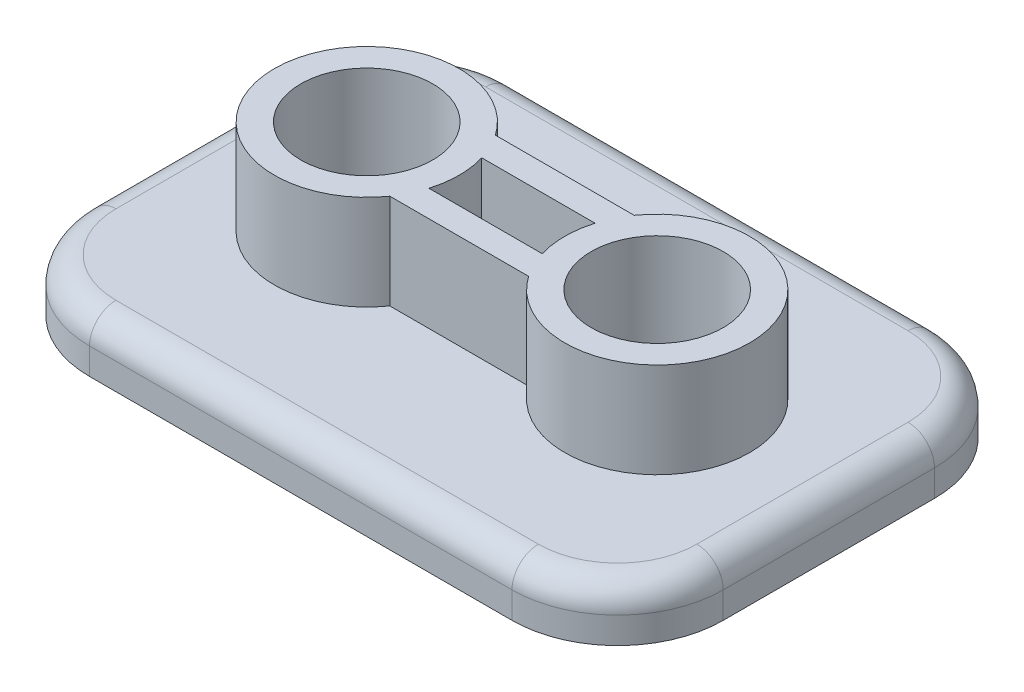
ISO-10303-21;
HEADER;
FILE_DESCRIPTION(('STEP AP214'),'2;1');
FILE_NAME('part.step','',(''),(''),'','','');
FILE_SCHEMA(('AUTOMOTIVE_DESIGN { 1 0 10303 214 1 1 1 1 }'));
ENDSEC;
DATA;
#1=APPLICATION_CONTEXT('core data for automotive mechanical design processes');
#2=APPLICATION_PROTOCOL_DEFINITION('international standard','automotive_design',2000,#1);
#3=PRODUCT_CONTEXT('',#1,'mechanical');
#4=PRODUCT('Part','Part','',(#3));
#5=PRODUCT_RELATED_PRODUCT_CATEGORY('part','',(#4));
#6=PRODUCT_DEFINITION_FORMATION('','',#4);
#7=PRODUCT_DEFINITION_CONTEXT('part definition',#1,'design');
#8=PRODUCT_DEFINITION('design','',#6,#7);
#9=PRODUCT_DEFINITION_SHAPE('','',#8);
#10=(LENGTH_UNIT() NAMED_UNIT(*) SI_UNIT(.MILLI.,.METRE.));
#11=(NAMED_UNIT(*) PLANE_ANGLE_UNIT() SI_UNIT($,.RADIAN.));
#12=(NAMED_UNIT(*) SI_UNIT($,.STERADIAN.) SOLID_ANGLE_UNIT());
#13=UNCERTAINTY_MEASURE_WITH_UNIT(LENGTH_MEASURE(1.E-05),#10,'distance_accuracy_value','');
#14=(GEOMETRIC_REPRESENTATION_CONTEXT(3) GLOBAL_UNCERTAINTY_ASSIGNED_CONTEXT((#13)) GLOBAL_UNIT_ASSIGNED_CONTEXT((#10,
#11,#12)) REPRESENTATION_CONTEXT('',''));
#15=CARTESIAN_POINT('',(0.,0.,0.));
#16=DIRECTION('',(0.,0.,1.));
#17=DIRECTION('',(1.,0.,0.));
#18=AXIS2_PLACEMENT_3D('',#15,#16,#17);
#19=CARTESIAN_POINT('',(0.,10.,0.));
#20=DIRECTION('',(0.,-1.,0.));
#21=DIRECTION('',(0.,0.,-1.));
#22=AXIS2_PLACEMENT_3D('',#19,#20,#21);
#23=PLANE('',#22);
#24=DIRECTION('',(-1.,0.,0.));
#25=VECTOR('',#24,1.);
#26=CARTESIAN_POINT('',(0.,10.,-75.));
#27=LINE('',#26,#25);
#28=CARTESIAN_POINT('',(100.,10.,-75.));
#29=VERTEX_POINT('',#28);
#30=CARTESIAN_POINT('',(20.,10.,-75.));
#31=VERTEX_POINT('',#30);
#32=EDGE_CURVE('E363',#29,#31,#27,.T.);
#33=ORIENTED_EDGE('',*,*,#32,.T.);
#34=CARTESIAN_POINT('',(20.,10.,-60.));
#35=DIRECTION('',(0.,-1.,0.));
#36=DIRECTION('',(0.,0.,-1.));
#37=AXIS2_PLACEMENT_3D('',#34,#35,#36);
#38=CIRCLE('',#37,15.);
#39=CARTESIAN_POINT('',(5.,10.,-60.));
#40=VERTEX_POINT('',#39);
#41=EDGE_CURVE('E366',#31,#40,#38,.F.);
#42=ORIENTED_EDGE('',*,*,#41,.T.);
#43=DIRECTION('',(0.,0.,1.));
#44=VECTOR('',#43,1.);
#45=CARTESIAN_POINT('',(5.,10.,0.));
#46=LINE('',#45,#44);
#47=CARTESIAN_POINT('',(5.,10.,-20.));
#48=VERTEX_POINT('',#47);
#49=EDGE_CURVE('E345',#40,#48,#46,.T.);
#50=ORIENTED_EDGE('',*,*,#49,.T.);
#51=CARTESIAN_POINT('',(20.,10.,-20.));
#52=DIRECTION('',(0.,-1.,0.));
#53=DIRECTION('',(0.,0.,-1.));
#54=AXIS2_PLACEMENT_3D('',#51,#52,#53);
#55=CIRCLE('',#54,15.);
#56=CARTESIAN_POINT('',(20.,10.,-5.));
#57=VERTEX_POINT('',#56);
#58=EDGE_CURVE('E348',#48,#57,#55,.F.);
#59=ORIENTED_EDGE('',*,*,#58,.T.);
#60=DIRECTION('',(1.,0.,0.));
#61=VECTOR('',#60,1.);
#62=CARTESIAN_POINT('',(0.,10.,-5.));
#63=LINE('',#62,#61);
#64=CARTESIAN_POINT('',(100.,10.,-5.));
#65=VERTEX_POINT('',#64);
#66=EDGE_CURVE('E351',#57,#65,#63,.T.);
#67=ORIENTED_EDGE('',*,*,#66,.T.);
#68=CARTESIAN_POINT('',(100.,10.,-20.));
#69=DIRECTION('',(0.,-1.,0.));
#70=DIRECTION('',(0.,0.,-1.));
#71=AXIS2_PLACEMENT_3D('',#68,#69,#70);
#72=CIRCLE('',#71,15.);
#73=CARTESIAN_POINT('',(115.,10.,-20.));
#74=VERTEX_POINT('',#73);
#75=EDGE_CURVE('E354',#65,#74,#72,.F.);
#76=ORIENTED_EDGE('',*,*,#75,.T.);
#77=DIRECTION('',(0.,0.,-1.));
#78=VECTOR('',#77,1.);
#79=CARTESIAN_POINT('',(115.,10.,0.));
#80=LINE('',#79,#78);
#81=CARTESIAN_POINT('',(115.,10.,-60.));
#82=VERTEX_POINT('',#81);
#83=EDGE_CURVE('E357',#74,#82,#80,.T.);
#84=ORIENTED_EDGE('',*,*,#83,.T.);
#85=CARTESIAN_POINT('',(100.,10.,-60.));
#86=DIRECTION('',(0.,-1.,0.));
#87=DIRECTION('',(0.,0.,-1.));
#88=AXIS2_PLACEMENT_3D('',#85,#86,#87);
#89=CIRCLE('',#88,15.);
#90=EDGE_CURVE('E360',#82,#29,#89,.F.);
#91=ORIENTED_EDGE('',*,*,#90,.T.);
#92=EDGE_LOOP('',(#33,#42,#50,#59,#67,#76,#84,#91));
#93=FACE_BOUND('',#92,.T.);
#94=CARTESIAN_POINT('',(87.5,10.,-40.));
#95=DIRECTION('',(0.,1.,0.));
#96=DIRECTION('',(0.,0.,1.));
#97=AXIS2_PLACEMENT_3D('',#94,#95,#96);
#98=CIRCLE('',#97,17.5);
#99=CARTESIAN_POINT('',(73.1385933836549,10.,-50.));
#100=VERTEX_POINT('',#99);
#101=CARTESIAN_POINT('',(73.1385933836549,10.,-30.));
#102=VERTEX_POINT('',#101);
#103=EDGE_CURVE('E249',#100,#102,#98,.F.);
#104=ORIENTED_EDGE('',*,*,#103,.T.);
#105=DIRECTION('',(-1.,0.,0.));
#106=VECTOR('',#105,1.);
#107=CARTESIAN_POINT('',(0.,10.,-30.));
#108=LINE('',#107,#106);
#109=CARTESIAN_POINT('',(46.8614066163451,10.,-30.));
#110=VERTEX_POINT('',#109);
#111=EDGE_CURVE('E260',#102,#110,#108,.T.);
#112=ORIENTED_EDGE('',*,*,#111,.T.);
#113=CARTESIAN_POINT('',(32.5,10.,-40.));
#114=DIRECTION('',(0.,1.,0.));
#115=DIRECTION('',(0.,0.,1.));
#116=AXIS2_PLACEMENT_3D('',#113,#114,#115);
#117=CIRCLE('',#116,17.5);
#118=CARTESIAN_POINT('',(46.8614066163451,10.,-50.));
#119=VERTEX_POINT('',#118);
#120=EDGE_CURVE('E215',#119,#110,#117,.T.);
#121=ORIENTED_EDGE('',*,*,#120,.F.);
#122=DIRECTION('',(-1.,0.,0.));
#123=VECTOR('',#122,1.);
#124=CARTESIAN_POINT('',(0.,10.,-50.));
#125=LINE('',#124,#123);
#126=EDGE_CURVE('E264',#100,#119,#125,.T.);
#127=ORIENTED_EDGE('',*,*,#126,.F.);
#128=EDGE_LOOP('',(#104,#112,#121,#127));
#129=FACE_BOUND('',#128,.T.);
#130=ADVANCED_FACE('F41',(#93,#129),#23,.F.);
#131=CARTESIAN_POINT('',(0.,10.,0.));
#132=DIRECTION('',(1.,0.,0.));
#133=DIRECTION('',(0.,0.,-1.));
#134=AXIS2_PLACEMENT_3D('',#131,#132,#133);
#135=PLANE('',#134);
#136=DIRECTION('',(0.,-1.,0.));
#137=VECTOR('',#136,1.);
#138=CARTESIAN_POINT('',(0.,10.,-20.));
#139=LINE('',#138,#137);
#140=CARTESIAN_POINT('',(0.,0.,-20.));
#141=VERTEX_POINT('',#140);
#142=CARTESIAN_POINT('',(0.,5.,-20.));
#143=VERTEX_POINT('',#142);
#144=EDGE_CURVE('E272',#141,#143,#139,.F.);
#145=ORIENTED_EDGE('',*,*,#144,.T.);
#146=DIRECTION('',(0.,0.,1.));
#147=VECTOR('',#146,1.);
#148=CARTESIAN_POINT('',(0.,5.,0.));
#149=LINE('',#148,#147);
#150=CARTESIAN_POINT('',(0.,5.,-60.));
#151=VERTEX_POINT('',#150);
#152=EDGE_CURVE('E11',#143,#151,#149,.F.);
#153=ORIENTED_EDGE('',*,*,#152,.T.);
#154=DIRECTION('',(0.,-1.,0.));
#155=VECTOR('',#154,1.);
#156=CARTESIAN_POINT('',(0.,10.,-60.));
#157=LINE('',#156,#155);
#158=CARTESIAN_POINT('',(0.,0.,-60.));
#159=VERTEX_POINT('',#158);
#160=EDGE_CURVE('E310',#151,#159,#157,.T.);
#161=ORIENTED_EDGE('',*,*,#160,.T.);
#162=DIRECTION('',(0.,0.,1.));
#163=VECTOR('',#162,1.);
#164=CARTESIAN_POINT('',(0.,0.,0.));
#165=LINE('',#164,#163);
#166=EDGE_CURVE('E285',#159,#141,#165,.T.);
#167=ORIENTED_EDGE('',*,*,#166,.T.);
#168=EDGE_LOOP('',(#145,#153,#161,#167));
#169=FACE_BOUND('',#168,.T.);
#170=ADVANCED_FACE('F474',(#169),#135,.F.);
#171=CARTESIAN_POINT('',(0.,10.,0.));
#172=DIRECTION('',(0.,0.,-1.));
#173=DIRECTION('',(-1.,0.,0.));
#174=AXIS2_PLACEMENT_3D('',#171,#172,#173);
#175=PLANE('',#174);
#176=DIRECTION('',(0.,-1.,0.));
#177=VECTOR('',#176,1.);
#178=CARTESIAN_POINT('',(100.,10.,0.));
#179=LINE('',#178,#177);
#180=CARTESIAN_POINT('',(100.,0.,0.));
#181=VERTEX_POINT('',#180);
#182=CARTESIAN_POINT('',(100.,5.,0.));
#183=VERTEX_POINT('',#182);
#184=EDGE_CURVE('E342',#181,#183,#179,.F.);
#185=ORIENTED_EDGE('',*,*,#184,.T.);
#186=DIRECTION('',(1.,0.,0.));
#187=VECTOR('',#186,1.);
#188=CARTESIAN_POINT('',(0.,5.,0.));
#189=LINE('',#188,#187);
#190=CARTESIAN_POINT('',(20.,5.,0.));
#191=VERTEX_POINT('',#190);
#192=EDGE_CURVE('E66',#183,#191,#189,.F.);
#193=ORIENTED_EDGE('',*,*,#192,.T.);
#194=DIRECTION('',(0.,-1.,0.));
#195=VECTOR('',#194,1.);
#196=CARTESIAN_POINT('',(20.,10.,0.));
#197=LINE('',#196,#195);
#198=CARTESIAN_POINT('',(20.,0.,0.));
#199=VERTEX_POINT('',#198);
#200=EDGE_CURVE('E339',#191,#199,#197,.T.);
#201=ORIENTED_EDGE('',*,*,#200,.T.);
#202=DIRECTION('',(1.,0.,0.));
#203=VECTOR('',#202,1.);
#204=CARTESIAN_POINT('',(0.,0.,0.));
#205=LINE('',#204,#203);
#206=EDGE_CURVE('E297',#199,#181,#205,.T.);
#207=ORIENTED_EDGE('',*,*,#206,.T.);
#208=EDGE_LOOP('',(#185,#193,#201,#207));
#209=FACE_BOUND('',#208,.T.);
#210=ADVANCED_FACE('F433',(#209),#175,.F.);
#211=CARTESIAN_POINT('',(120.,10.,0.));
#212=DIRECTION('',(-1.,0.,0.));
#213=DIRECTION('',(0.,0.,1.));
#214=AXIS2_PLACEMENT_3D('',#211,#212,#213);
#215=PLANE('',#214);
#216=DIRECTION('',(0.,-1.,0.));
#217=VECTOR('',#216,1.);
#218=CARTESIAN_POINT('',(120.,10.,-60.));
#219=LINE('',#218,#217);
#220=CARTESIAN_POINT('',(120.,0.,-60.));
#221=VERTEX_POINT('',#220);
#222=CARTESIAN_POINT('',(120.,5.,-60.));
#223=VERTEX_POINT('',#222);
#224=EDGE_CURVE('E335',#221,#223,#219,.F.);
#225=ORIENTED_EDGE('',*,*,#224,.T.);
#226=DIRECTION('',(0.,0.,-1.));
#227=VECTOR('',#226,1.);
#228=CARTESIAN_POINT('',(120.,5.,0.));
#229=LINE('',#228,#227);
#230=CARTESIAN_POINT('',(120.,5.,-20.));
#231=VERTEX_POINT('',#230);
#232=EDGE_CURVE('E380',#223,#231,#229,.F.);
#233=ORIENTED_EDGE('',*,*,#232,.T.);
#234=DIRECTION('',(0.,-1.,0.));
#235=VECTOR('',#234,1.);
#236=CARTESIAN_POINT('',(120.,10.,-20.));
#237=LINE('',#236,#235);
#238=CARTESIAN_POINT('',(120.,0.,-20.));
#239=VERTEX_POINT('',#238);
#240=EDGE_CURVE('E332',#231,#239,#237,.T.);
#241=ORIENTED_EDGE('',*,*,#240,.T.);
#242=DIRECTION('',(0.,0.,-1.));
#243=VECTOR('',#242,1.);
#244=CARTESIAN_POINT('',(120.,0.,0.));
#245=LINE('',#244,#243);
#246=EDGE_CURVE('E301',#239,#221,#245,.T.);
#247=ORIENTED_EDGE('',*,*,#246,.T.);
#248=EDGE_LOOP('',(#225,#233,#241,#247));
#249=FACE_BOUND('',#248,.T.);
#250=ADVANCED_FACE('F444',(#249),#215,.F.);
#251=CARTESIAN_POINT('',(0.,10.,-80.));
#252=DIRECTION('',(0.,0.,1.));
#253=DIRECTION('',(1.,0.,0.));
#254=AXIS2_PLACEMENT_3D('',#251,#252,#253);
#255=PLANE('',#254);
#256=DIRECTION('',(0.,-1.,0.));
#257=VECTOR('',#256,1.);
#258=CARTESIAN_POINT('',(20.,10.,-80.));
#259=LINE('',#258,#257);
#260=CARTESIAN_POINT('',(20.,0.,-80.));
#261=VERTEX_POINT('',#260);
#262=CARTESIAN_POINT('',(20.,5.,-80.));
#263=VERTEX_POINT('',#262);
#264=EDGE_CURVE('E328',#261,#263,#259,.F.);
#265=ORIENTED_EDGE('',*,*,#264,.T.);
#266=DIRECTION('',(-1.,0.,0.));
#267=VECTOR('',#266,1.);
#268=CARTESIAN_POINT('',(0.,5.,-80.));
#269=LINE('',#268,#267);
#270=CARTESIAN_POINT('',(100.,5.,-80.));
#271=VERTEX_POINT('',#270);
#272=EDGE_CURVE('E374',#263,#271,#269,.F.);
#273=ORIENTED_EDGE('',*,*,#272,.T.);
#274=DIRECTION('',(0.,-1.,0.));
#275=VECTOR('',#274,1.);
#276=CARTESIAN_POINT('',(100.,10.,-80.));
#277=LINE('',#276,#275);
#278=CARTESIAN_POINT('',(100.,0.,-80.));
#279=VERTEX_POINT('',#278);
#280=EDGE_CURVE('E325',#271,#279,#277,.T.);
#281=ORIENTED_EDGE('',*,*,#280,.T.);
#282=DIRECTION('',(-1.,0.,0.));
#283=VECTOR('',#282,1.);
#284=CARTESIAN_POINT('',(0.,0.,-80.));
#285=LINE('',#284,#283);
#286=EDGE_CURVE('E273',#279,#261,#285,.T.);
#287=ORIENTED_EDGE('',*,*,#286,.T.);
#288=EDGE_LOOP('',(#265,#273,#281,#287));
#289=FACE_BOUND('',#288,.T.);
#290=ADVANCED_FACE('F602',(#289),#255,.F.);
#291=CARTESIAN_POINT('',(0.,0.,0.));
#292=DIRECTION('',(0.,-1.,0.));
#293=DIRECTION('',(0.,0.,-1.));
#294=AXIS2_PLACEMENT_3D('',#291,#292,#293);
#295=PLANE('',#294);
#296=ORIENTED_EDGE('',*,*,#166,.F.);
#297=CARTESIAN_POINT('',(20.,0.,-60.));
#298=DIRECTION('',(0.,-1.,0.));
#299=DIRECTION('',(0.,0.,-1.));
#300=AXIS2_PLACEMENT_3D('',#297,#298,#299);
#301=CIRCLE('',#300,20.);
#302=EDGE_CURVE('E322',#159,#261,#301,.T.);
#303=ORIENTED_EDGE('',*,*,#302,.T.);
#304=ORIENTED_EDGE('',*,*,#286,.F.);
#305=CARTESIAN_POINT('',(100.,0.,-60.));
#306=DIRECTION('',(0.,-1.,0.));
#307=DIRECTION('',(0.,0.,-1.));
#308=AXIS2_PLACEMENT_3D('',#305,#306,#307);
#309=CIRCLE('',#308,20.);
#310=EDGE_CURVE('E319',#279,#221,#309,.T.);
#311=ORIENTED_EDGE('',*,*,#310,.T.);
#312=ORIENTED_EDGE('',*,*,#246,.F.);
#313=CARTESIAN_POINT('',(100.,0.,-20.));
#314=DIRECTION('',(0.,-1.,0.));
#315=DIRECTION('',(0.,0.,-1.));
#316=AXIS2_PLACEMENT_3D('',#313,#314,#315);
#317=CIRCLE('',#316,20.);
#318=EDGE_CURVE('E316',#239,#181,#317,.T.);
#319=ORIENTED_EDGE('',*,*,#318,.T.);
#320=ORIENTED_EDGE('',*,*,#206,.F.);
#321=CARTESIAN_POINT('',(20.,0.,-20.));
#322=DIRECTION('',(0.,-1.,0.));
#323=DIRECTION('',(0.,0.,-1.));
#324=AXIS2_PLACEMENT_3D('',#321,#322,#323);
#325=CIRCLE('',#324,20.);
#326=EDGE_CURVE('E313',#199,#141,#325,.T.);
#327=ORIENTED_EDGE('',*,*,#326,.T.);
#328=EDGE_LOOP('',(#296,#303,#304,#311,#312,#319,#320,#327));
#329=FACE_BOUND('',#328,.T.);
#330=ADVANCED_FACE('F438',(#329),#295,.T.);
#331=CARTESIAN_POINT('',(0.,28.,-30.));
#332=DIRECTION('',(0.,0.,1.));
#333=DIRECTION('',(1.,0.,0.));
#334=AXIS2_PLACEMENT_3D('',#331,#332,#333);
#335=PLANE('',#334);
#336=ORIENTED_EDGE('',*,*,#111,.F.);
#337=DIRECTION('',(0.,-1.,0.));
#338=VECTOR('',#337,1.);
#339=CARTESIAN_POINT('',(73.1385933836549,28.,-30.));
#340=LINE('',#339,#338);
#341=CARTESIAN_POINT('',(73.1385933836549,28.,-30.));
#342=VERTEX_POINT('',#341);
#343=EDGE_CURVE('E282',#342,#102,#340,.T.);
#344=ORIENTED_EDGE('',*,*,#343,.F.);
#345=DIRECTION('',(-1.,0.,0.));
#346=VECTOR('',#345,1.);
#347=CARTESIAN_POINT('',(0.,28.,-30.));
#348=LINE('',#347,#346);
#349=CARTESIAN_POINT('',(46.8614066163451,28.,-30.));
#350=VERTEX_POINT('',#349);
#351=EDGE_CURVE('E220',#342,#350,#348,.T.);
#352=ORIENTED_EDGE('',*,*,#351,.T.);
#353=DIRECTION('',(0.,-1.,0.));
#354=VECTOR('',#353,1.);
#355=CARTESIAN_POINT('',(46.8614066163451,28.,-30.));
#356=LINE('',#355,#354);
#357=EDGE_CURVE('E192',#350,#110,#356,.T.);
#358=ORIENTED_EDGE('',*,*,#357,.T.);
#359=EDGE_LOOP('',(#336,#344,#352,#358));
#360=FACE_BOUND('',#359,.T.);
#361=ADVANCED_FACE('F523',(#360),#335,.T.);
#362=CARTESIAN_POINT('',(87.5,28.,-40.));
#363=DIRECTION('',(0.,-1.,0.));
#364=DIRECTION('',(0.,0.,-1.));
#365=AXIS2_PLACEMENT_3D('',#362,#363,#364);
#366=CYLINDRICAL_SURFACE('',#365,17.5);
#367=ORIENTED_EDGE('',*,*,#103,.F.);
#368=DIRECTION('',(0.,-1.,0.));
#369=VECTOR('',#368,1.);
#370=CARTESIAN_POINT('',(73.1385933836549,28.,-50.));
#371=LINE('',#370,#369);
#372=CARTESIAN_POINT('',(73.1385933836549,28.,-50.));
#373=VERTEX_POINT('',#372);
#374=EDGE_CURVE('E279',#373,#100,#371,.T.);
#375=ORIENTED_EDGE('',*,*,#374,.F.);
#376=CARTESIAN_POINT('',(87.5,28.,-40.));
#377=DIRECTION('',(0.,1.,0.));
#378=DIRECTION('',(0.,0.,1.));
#379=AXIS2_PLACEMENT_3D('',#376,#377,#378);
#380=CIRCLE('',#379,17.5);
#381=EDGE_CURVE('E212',#373,#342,#380,.F.);
#382=ORIENTED_EDGE('',*,*,#381,.T.);
#383=ORIENTED_EDGE('',*,*,#343,.T.);
#384=EDGE_LOOP('',(#367,#375,#382,#383));
#385=FACE_BOUND('',#384,.T.);
#386=ADVANCED_FACE('F526',(#385),#366,.T.);
#387=CARTESIAN_POINT('',(0.,28.,-50.));
#388=DIRECTION('',(0.,0.,1.));
#389=DIRECTION('',(1.,0.,0.));
#390=AXIS2_PLACEMENT_3D('',#387,#388,#389);
#391=PLANE('',#390);
#392=ORIENTED_EDGE('',*,*,#126,.T.);
#393=DIRECTION('',(0.,-1.,0.));
#394=VECTOR('',#393,1.);
#395=CARTESIAN_POINT('',(46.8614066163451,28.,-50.));
#396=LINE('',#395,#394);
#397=CARTESIAN_POINT('',(46.8614066163451,28.,-50.));
#398=VERTEX_POINT('',#397);
#399=EDGE_CURVE('E276',#398,#119,#396,.T.);
#400=ORIENTED_EDGE('',*,*,#399,.F.);
#401=DIRECTION('',(-1.,0.,0.));
#402=VECTOR('',#401,1.);
#403=CARTESIAN_POINT('',(0.,28.,-50.));
#404=LINE('',#403,#402);
#405=EDGE_CURVE('E219',#373,#398,#404,.T.);
#406=ORIENTED_EDGE('',*,*,#405,.F.);
#407=ORIENTED_EDGE('',*,*,#374,.T.);
#408=EDGE_LOOP('',(#392,#400,#406,#407));
#409=FACE_BOUND('',#408,.T.);
#410=ADVANCED_FACE('F531',(#409),#391,.F.);
#411=CARTESIAN_POINT('',(70.7294901687516,10.,-35.));
#412=VERTEX_POINT('',#411);
#413=CARTESIAN_POINT('',(70.7294901687516,10.,-45.));
#414=VERTEX_POINT('',#413);
#415=EDGE_CURVE('E188',#412,#414,#98,.F.);
#416=ORIENTED_EDGE('',*,*,#415,.F.);
#417=DIRECTION('',(0.,-1.,0.));
#418=VECTOR('',#417,1.);
#419=CARTESIAN_POINT('',(70.7294901687516,28.,-35.));
#420=LINE('',#419,#418);
#421=CARTESIAN_POINT('',(70.7294901687516,28.,-35.));
#422=VERTEX_POINT('',#421);
#423=EDGE_CURVE('E182',#422,#412,#420,.T.);
#424=ORIENTED_EDGE('',*,*,#423,.F.);
#425=CARTESIAN_POINT('',(70.7294901687516,28.,-45.));
#426=VERTEX_POINT('',#425);
#427=EDGE_CURVE('E187',#422,#426,#380,.F.);
#428=ORIENTED_EDGE('',*,*,#427,.T.);
#429=DIRECTION('',(0.,-1.,0.));
#430=VECTOR('',#429,1.);
#431=CARTESIAN_POINT('',(70.7294901687516,28.,-45.));
#432=LINE('',#431,#430);
#433=EDGE_CURVE('E245',#426,#414,#432,.T.);
#434=ORIENTED_EDGE('',*,*,#433,.T.);
#435=EDGE_LOOP('',(#416,#424,#428,#434));
#436=FACE_BOUND('',#435,.T.);
#437=ADVANCED_FACE('F184',(#436),#366,.T.);
#438=CARTESIAN_POINT('',(0.,28.,-35.));
#439=DIRECTION('',(0.,0.,1.));
#440=DIRECTION('',(1.,0.,0.));
#441=AXIS2_PLACEMENT_3D('',#438,#439,#440);
#442=PLANE('',#441);
#443=DIRECTION('',(-1.,0.,0.));
#444=VECTOR('',#443,1.);
#445=CARTESIAN_POINT('',(0.,10.,-35.));
#446=LINE('',#445,#444);
#447=CARTESIAN_POINT('',(49.2705098312484,10.,-35.));
#448=VERTEX_POINT('',#447);
#449=EDGE_CURVE('E248',#412,#448,#446,.T.);
#450=ORIENTED_EDGE('',*,*,#449,.T.);
#451=DIRECTION('',(0.,-1.,0.));
#452=VECTOR('',#451,1.);
#453=CARTESIAN_POINT('',(49.2705098312484,28.,-35.));
#454=LINE('',#453,#452);
#455=CARTESIAN_POINT('',(49.2705098312484,28.,-35.));
#456=VERTEX_POINT('',#455);
#457=EDGE_CURVE('E193',#456,#448,#454,.T.);
#458=ORIENTED_EDGE('',*,*,#457,.F.);
#459=DIRECTION('',(-1.,0.,0.));
#460=VECTOR('',#459,1.);
#461=CARTESIAN_POINT('',(0.,28.,-35.));
#462=LINE('',#461,#460);
#463=EDGE_CURVE('E196',#422,#456,#462,.T.);
#464=ORIENTED_EDGE('',*,*,#463,.F.);
#465=ORIENTED_EDGE('',*,*,#423,.T.);
#466=EDGE_LOOP('',(#450,#458,#464,#465));
#467=FACE_BOUND('',#466,.T.);
#468=ADVANCED_FACE('F197',(#467),#442,.F.);
#469=CARTESIAN_POINT('',(32.5,28.,-40.));
#470=DIRECTION('',(0.,-1.,0.));
#471=DIRECTION('',(0.,0.,-1.));
#472=AXIS2_PLACEMENT_3D('',#469,#470,#471);
#473=CYLINDRICAL_SURFACE('',#472,17.5);
#474=CARTESIAN_POINT('',(49.2705098312484,10.,-45.));
#475=VERTEX_POINT('',#474);
#476=EDGE_CURVE('E252',#448,#475,#117,.T.);
#477=ORIENTED_EDGE('',*,*,#476,.T.);
#478=DIRECTION('',(0.,-1.,0.));
#479=VECTOR('',#478,1.);
#480=CARTESIAN_POINT('',(49.2705098312484,28.,-45.));
#481=LINE('',#480,#479);
#482=CARTESIAN_POINT('',(49.2705098312484,28.,-45.));
#483=VERTEX_POINT('',#482);
#484=EDGE_CURVE('E288',#483,#475,#481,.T.);
#485=ORIENTED_EDGE('',*,*,#484,.F.);
#486=CARTESIAN_POINT('',(32.5,28.,-40.));
#487=DIRECTION('',(0.,1.,0.));
#488=DIRECTION('',(0.,0.,1.));
#489=AXIS2_PLACEMENT_3D('',#486,#487,#488);
#490=CIRCLE('',#489,17.5);
#491=EDGE_CURVE('E202',#456,#483,#490,.T.);
#492=ORIENTED_EDGE('',*,*,#491,.F.);
#493=ORIENTED_EDGE('',*,*,#457,.T.);
#494=EDGE_LOOP('',(#477,#485,#492,#493));
#495=FACE_BOUND('',#494,.T.);
#496=ADVANCED_FACE('F511',(#495),#473,.T.);
#497=CARTESIAN_POINT('',(32.5,28.,-40.));
#498=DIRECTION('',(0.,-1.,0.));
#499=DIRECTION('',(0.,0.,-1.));
#500=AXIS2_PLACEMENT_3D('',#497,#498,#499);
#501=CYLINDRICAL_SURFACE('',#500,12.5);
#502=CARTESIAN_POINT('',(32.5,28.,-40.));
#503=DIRECTION('',(0.,1.,0.));
#504=DIRECTION('',(0.,0.,1.));
#505=AXIS2_PLACEMENT_3D('',#502,#503,#504);
#506=CIRCLE('',#505,12.5);
#507=CARTESIAN_POINT('',(32.5,28.,-27.5));
#508=VERTEX_POINT('',#507);
#509=EDGE_CURVE('E237',#508,#508,#506,.T.);
#510=ORIENTED_EDGE('',*,*,#509,.T.);
#511=EDGE_LOOP('',(#510));
#512=FACE_BOUND('',#511,.T.);
#513=CARTESIAN_POINT('',(32.5,10.,-40.));
#514=DIRECTION('',(0.,1.,0.));
#515=DIRECTION('',(0.,0.,1.));
#516=AXIS2_PLACEMENT_3D('',#513,#514,#515);
#517=CIRCLE('',#516,12.5);
#518=CARTESIAN_POINT('',(32.5,10.,-27.5));
#519=VERTEX_POINT('',#518);
#520=EDGE_CURVE('E210',#519,#519,#517,.T.);
#521=ORIENTED_EDGE('',*,*,#520,.F.);
#522=EDGE_LOOP('',(#521));
#523=FACE_BOUND('',#522,.T.);
#524=ADVANCED_FACE('F552',(#512,#523),#501,.F.);
#525=ORIENTED_EDGE('',*,*,#120,.T.);
#526=ORIENTED_EDGE('',*,*,#357,.F.);
#527=EDGE_CURVE('E227',#398,#350,#490,.T.);
#528=ORIENTED_EDGE('',*,*,#527,.F.);
#529=ORIENTED_EDGE('',*,*,#399,.T.);
#530=EDGE_LOOP('',(#525,#526,#528,#529));
#531=FACE_BOUND('',#530,.T.);
#532=ADVANCED_FACE('F521',(#531),#473,.T.);
#533=CARTESIAN_POINT('',(0.,28.,-45.));
#534=DIRECTION('',(0.,0.,-1.));
#535=DIRECTION('',(-1.,0.,0.));
#536=AXIS2_PLACEMENT_3D('',#533,#534,#535);
#537=PLANE('',#536);
#538=DIRECTION('',(1.,0.,0.));
#539=VECTOR('',#538,1.);
#540=CARTESIAN_POINT('',(0.,10.,-45.));
#541=LINE('',#540,#539);
#542=EDGE_CURVE('E256',#475,#414,#541,.T.);
#543=ORIENTED_EDGE('',*,*,#542,.T.);
#544=ORIENTED_EDGE('',*,*,#433,.F.);
#545=DIRECTION('',(1.,0.,0.));
#546=VECTOR('',#545,1.);
#547=CARTESIAN_POINT('',(0.,28.,-45.));
#548=LINE('',#547,#546);
#549=EDGE_CURVE('E207',#483,#426,#548,.T.);
#550=ORIENTED_EDGE('',*,*,#549,.F.);
#551=ORIENTED_EDGE('',*,*,#484,.T.);
#552=EDGE_LOOP('',(#543,#544,#550,#551));
#553=FACE_BOUND('',#552,.T.);
#554=ADVANCED_FACE('F544',(#553),#537,.F.);
#555=CARTESIAN_POINT('',(87.5,28.,-40.));
#556=DIRECTION('',(0.,-1.,0.));
#557=DIRECTION('',(0.,0.,-1.));
#558=AXIS2_PLACEMENT_3D('',#555,#556,#557);
#559=CYLINDRICAL_SURFACE('',#558,12.5);
#560=CARTESIAN_POINT('',(87.5,28.,-40.));
#561=DIRECTION('',(0.,1.,0.));
#562=DIRECTION('',(0.,0.,1.));
#563=AXIS2_PLACEMENT_3D('',#560,#561,#562);
#564=CIRCLE('',#563,12.5);
#565=CARTESIAN_POINT('',(87.5,28.,-27.5));
#566=VERTEX_POINT('',#565);
#567=EDGE_CURVE('E241',#566,#566,#564,.F.);
#568=ORIENTED_EDGE('',*,*,#567,.F.);
#569=EDGE_LOOP('',(#568));
#570=FACE_BOUND('',#569,.T.);
#571=CARTESIAN_POINT('',(87.5,10.,-40.));
#572=DIRECTION('',(0.,1.,0.));
#573=DIRECTION('',(0.,0.,1.));
#574=AXIS2_PLACEMENT_3D('',#571,#572,#573);
#575=CIRCLE('',#574,12.5);
#576=CARTESIAN_POINT('',(87.5,10.,-27.5));
#577=VERTEX_POINT('',#576);
#578=EDGE_CURVE('E268',#577,#577,#575,.F.);
#579=ORIENTED_EDGE('',*,*,#578,.T.);
#580=EDGE_LOOP('',(#579));
#581=FACE_BOUND('',#580,.T.);
#582=ADVANCED_FACE('F546',(#570,#581),#559,.F.);
#583=CARTESIAN_POINT('',(0.,28.,0.));
#584=DIRECTION('',(0.,1.,0.));
#585=DIRECTION('',(0.,0.,1.));
#586=AXIS2_PLACEMENT_3D('',#583,#584,#585);
#587=PLANE('',#586);
#588=ORIENTED_EDGE('',*,*,#427,.F.);
#589=ORIENTED_EDGE('',*,*,#463,.T.);
#590=ORIENTED_EDGE('',*,*,#491,.T.);
#591=ORIENTED_EDGE('',*,*,#549,.T.);
#592=EDGE_LOOP('',(#588,#589,#590,#591));
#593=FACE_BOUND('',#592,.T.);
#594=ORIENTED_EDGE('',*,*,#351,.F.);
#595=ORIENTED_EDGE('',*,*,#381,.F.);
#596=ORIENTED_EDGE('',*,*,#405,.T.);
#597=ORIENTED_EDGE('',*,*,#527,.T.);
#598=EDGE_LOOP('',(#594,#595,#596,#597));
#599=FACE_BOUND('',#598,.T.);
#600=ORIENTED_EDGE('',*,*,#509,.F.);
#601=EDGE_LOOP('',(#600));
#602=FACE_BOUND('',#601,.T.);
#603=ORIENTED_EDGE('',*,*,#567,.T.);
#604=EDGE_LOOP('',(#603));
#605=FACE_BOUND('',#604,.T.);
#606=ADVANCED_FACE('F204',(#593,#599,#602,#605),#587,.T.);
#607=ORIENTED_EDGE('',*,*,#578,.F.);
#608=EDGE_LOOP('',(#607));
#609=FACE_BOUND('',#608,.T.);
#610=ADVANCED_FACE('F491',(#609),#23,.F.);
#611=ORIENTED_EDGE('',*,*,#520,.T.);
#612=EDGE_LOOP('',(#611));
#613=FACE_BOUND('',#612,.T.);
#614=ADVANCED_FACE('F497',(#613),#23,.F.);
#615=ORIENTED_EDGE('',*,*,#449,.F.);
#616=ORIENTED_EDGE('',*,*,#415,.T.);
#617=ORIENTED_EDGE('',*,*,#542,.F.);
#618=ORIENTED_EDGE('',*,*,#476,.F.);
#619=EDGE_LOOP('',(#615,#616,#617,#618));
#620=FACE_BOUND('',#619,.T.);
#621=ADVANCED_FACE('F492',(#620),#23,.F.);
#622=CARTESIAN_POINT('',(20.,10.,-60.));
#623=DIRECTION('',(0.,-1.,0.));
#624=DIRECTION('',(0.,0.,-1.));
#625=AXIS2_PLACEMENT_3D('',#622,#623,#624);
#626=CYLINDRICAL_SURFACE('',#625,20.);
#627=ORIENTED_EDGE('',*,*,#160,.F.);
#628=CARTESIAN_POINT('',(20.,5.,-60.));
#629=DIRECTION('',(0.,-1.,0.));
#630=DIRECTION('',(0.,0.,-1.));
#631=AXIS2_PLACEMENT_3D('',#628,#629,#630);
#632=CIRCLE('',#631,20.);
#633=EDGE_CURVE('E370',#151,#263,#632,.T.);
#634=ORIENTED_EDGE('',*,*,#633,.T.);
#635=ORIENTED_EDGE('',*,*,#264,.F.);
#636=ORIENTED_EDGE('',*,*,#302,.F.);
#637=EDGE_LOOP('',(#627,#634,#635,#636));
#638=FACE_BOUND('',#637,.T.);
#639=ADVANCED_FACE('F478',(#638),#626,.T.);
#640=CARTESIAN_POINT('',(100.,10.,-60.));
#641=DIRECTION('',(0.,-1.,0.));
#642=DIRECTION('',(0.,0.,-1.));
#643=AXIS2_PLACEMENT_3D('',#640,#641,#642);
#644=CYLINDRICAL_SURFACE('',#643,20.);
#645=ORIENTED_EDGE('',*,*,#280,.F.);
#646=CARTESIAN_POINT('',(100.,5.,-60.));
#647=DIRECTION('',(0.,-1.,0.));
#648=DIRECTION('',(0.,0.,-1.));
#649=AXIS2_PLACEMENT_3D('',#646,#647,#648);
#650=CIRCLE('',#649,20.);
#651=EDGE_CURVE('E377',#271,#223,#650,.T.);
#652=ORIENTED_EDGE('',*,*,#651,.T.);
#653=ORIENTED_EDGE('',*,*,#224,.F.);
#654=ORIENTED_EDGE('',*,*,#310,.F.);
#655=EDGE_LOOP('',(#645,#652,#653,#654));
#656=FACE_BOUND('',#655,.T.);
#657=ADVANCED_FACE('F447',(#656),#644,.T.);
#658=CARTESIAN_POINT('',(100.,10.,-20.));
#659=DIRECTION('',(0.,-1.,0.));
#660=DIRECTION('',(0.,0.,-1.));
#661=AXIS2_PLACEMENT_3D('',#658,#659,#660);
#662=CYLINDRICAL_SURFACE('',#661,20.);
#663=ORIENTED_EDGE('',*,*,#240,.F.);
#664=CARTESIAN_POINT('',(100.,5.,-20.));
#665=DIRECTION('',(0.,-1.,0.));
#666=DIRECTION('',(0.,0.,-1.));
#667=AXIS2_PLACEMENT_3D('',#664,#665,#666);
#668=CIRCLE('',#667,20.);
#669=EDGE_CURVE('E383',#231,#183,#668,.T.);
#670=ORIENTED_EDGE('',*,*,#669,.T.);
#671=ORIENTED_EDGE('',*,*,#184,.F.);
#672=ORIENTED_EDGE('',*,*,#318,.F.);
#673=EDGE_LOOP('',(#663,#670,#671,#672));
#674=FACE_BOUND('',#673,.T.);
#675=ADVANCED_FACE('F431',(#674),#662,.T.);
#676=CARTESIAN_POINT('',(20.,10.,-20.));
#677=DIRECTION('',(0.,-1.,0.));
#678=DIRECTION('',(0.,0.,-1.));
#679=AXIS2_PLACEMENT_3D('',#676,#677,#678);
#680=CYLINDRICAL_SURFACE('',#679,20.);
#681=ORIENTED_EDGE('',*,*,#200,.F.);
#682=CARTESIAN_POINT('',(20.,5.,-20.));
#683=DIRECTION('',(0.,-1.,0.));
#684=DIRECTION('',(0.,0.,-1.));
#685=AXIS2_PLACEMENT_3D('',#682,#683,#684);
#686=CIRCLE('',#685,20.);
#687=EDGE_CURVE('E51',#191,#143,#686,.T.);
#688=ORIENTED_EDGE('',*,*,#687,.T.);
#689=ORIENTED_EDGE('',*,*,#144,.F.);
#690=ORIENTED_EDGE('',*,*,#326,.F.);
#691=EDGE_LOOP('',(#681,#688,#689,#690));
#692=FACE_BOUND('',#691,.T.);
#693=ADVANCED_FACE('F658',(#692),#680,.T.);
#694=CARTESIAN_POINT('',(100.,5.,-20.));
#695=DIRECTION('',(0.,-1.,0.));
#696=DIRECTION('',(0.,0.,-1.));
#697=AXIS2_PLACEMENT_3D('',#694,#695,#696);
#698=TOROIDAL_SURFACE('',#697,15.,5.);
#699=CARTESIAN_POINT('',(100.,5.,-5.));
#700=DIRECTION('',(-1.,0.,0.));
#701=DIRECTION('',(0.,0.,1.));
#702=AXIS2_PLACEMENT_3D('',#699,#700,#701);
#703=CIRCLE('',#702,5.);
#704=EDGE_CURVE('E411',#183,#65,#703,.T.);
#705=ORIENTED_EDGE('',*,*,#704,.F.);
#706=ORIENTED_EDGE('',*,*,#669,.F.);
#707=CARTESIAN_POINT('',(115.,5.,-20.));
#708=DIRECTION('',(0.,0.,-1.));
#709=DIRECTION('',(-1.,0.,0.));
#710=AXIS2_PLACEMENT_3D('',#707,#708,#709);
#711=CIRCLE('',#710,5.);
#712=EDGE_CURVE('E45',#74,#231,#711,.T.);
#713=ORIENTED_EDGE('',*,*,#712,.F.);
#714=ORIENTED_EDGE('',*,*,#75,.F.);
#715=EDGE_LOOP('',(#705,#706,#713,#714));
#716=FACE_BOUND('',#715,.T.);
#717=ADVANCED_FACE('F43',(#716),#698,.T.);
#718=CARTESIAN_POINT('',(115.,5.,0.));
#719=DIRECTION('',(0.,0.,-1.));
#720=DIRECTION('',(-1.,0.,0.));
#721=AXIS2_PLACEMENT_3D('',#718,#719,#720);
#722=CYLINDRICAL_SURFACE('',#721,5.);
#723=ORIENTED_EDGE('',*,*,#712,.T.);
#724=ORIENTED_EDGE('',*,*,#232,.F.);
#725=CARTESIAN_POINT('',(115.,5.,-60.));
#726=DIRECTION('',(0.,0.,-1.));
#727=DIRECTION('',(-1.,0.,0.));
#728=AXIS2_PLACEMENT_3D('',#725,#726,#727);
#729=CIRCLE('',#728,5.);
#730=EDGE_CURVE('E408',#82,#223,#729,.T.);
#731=ORIENTED_EDGE('',*,*,#730,.F.);
#732=ORIENTED_EDGE('',*,*,#83,.F.);
#733=EDGE_LOOP('',(#723,#724,#731,#732));
#734=FACE_BOUND('',#733,.T.);
#735=ADVANCED_FACE('F423',(#734),#722,.T.);
#736=CARTESIAN_POINT('',(0.,5.,-5.));
#737=DIRECTION('',(1.,0.,0.));
#738=DIRECTION('',(0.,0.,-1.));
#739=AXIS2_PLACEMENT_3D('',#736,#737,#738);
#740=CYLINDRICAL_SURFACE('',#739,5.);
#741=ORIENTED_EDGE('',*,*,#704,.T.);
#742=ORIENTED_EDGE('',*,*,#66,.F.);
#743=CARTESIAN_POINT('',(20.,5.,-5.));
#744=DIRECTION('',(-1.,0.,0.));
#745=DIRECTION('',(0.,0.,1.));
#746=AXIS2_PLACEMENT_3D('',#743,#744,#745);
#747=CIRCLE('',#746,5.);
#748=EDGE_CURVE('E404',#191,#57,#747,.T.);
#749=ORIENTED_EDGE('',*,*,#748,.F.);
#750=ORIENTED_EDGE('',*,*,#192,.F.);
#751=EDGE_LOOP('',(#741,#742,#749,#750));
#752=FACE_BOUND('',#751,.T.);
#753=ADVANCED_FACE('F463',(#752),#740,.T.);
#754=CARTESIAN_POINT('',(100.,5.,-60.));
#755=DIRECTION('',(0.,-1.,0.));
#756=DIRECTION('',(0.,0.,-1.));
#757=AXIS2_PLACEMENT_3D('',#754,#755,#756);
#758=TOROIDAL_SURFACE('',#757,15.,5.);
#759=ORIENTED_EDGE('',*,*,#730,.T.);
#760=ORIENTED_EDGE('',*,*,#651,.F.);
#761=CARTESIAN_POINT('',(100.,5.,-75.));
#762=DIRECTION('',(-1.,0.,0.));
#763=DIRECTION('',(0.,0.,1.));
#764=AXIS2_PLACEMENT_3D('',#761,#762,#763);
#765=CIRCLE('',#764,5.);
#766=EDGE_CURVE('E400',#29,#271,#765,.T.);
#767=ORIENTED_EDGE('',*,*,#766,.F.);
#768=ORIENTED_EDGE('',*,*,#90,.F.);
#769=EDGE_LOOP('',(#759,#760,#767,#768));
#770=FACE_BOUND('',#769,.T.);
#771=ADVANCED_FACE('F451',(#770),#758,.T.);
#772=CARTESIAN_POINT('',(20.,5.,-20.));
#773=DIRECTION('',(0.,-1.,0.));
#774=DIRECTION('',(0.,0.,-1.));
#775=AXIS2_PLACEMENT_3D('',#772,#773,#774);
#776=TOROIDAL_SURFACE('',#775,15.,5.);
#777=ORIENTED_EDGE('',*,*,#748,.T.);
#778=ORIENTED_EDGE('',*,*,#58,.F.);
#779=CARTESIAN_POINT('',(5.,5.,-20.));
#780=DIRECTION('',(0.,0.,-1.));
#781=DIRECTION('',(-1.,0.,0.));
#782=AXIS2_PLACEMENT_3D('',#779,#780,#781);
#783=CIRCLE('',#782,5.);
#784=EDGE_CURVE('E396',#143,#48,#783,.T.);
#785=ORIENTED_EDGE('',*,*,#784,.F.);
#786=ORIENTED_EDGE('',*,*,#687,.F.);
#787=EDGE_LOOP('',(#777,#778,#785,#786));
#788=FACE_BOUND('',#787,.T.);
#789=ADVANCED_FACE('F465',(#788),#776,.T.);
#790=CARTESIAN_POINT('',(0.,5.,-75.));
#791=DIRECTION('',(-1.,0.,0.));
#792=DIRECTION('',(0.,0.,1.));
#793=AXIS2_PLACEMENT_3D('',#790,#791,#792);
#794=CYLINDRICAL_SURFACE('',#793,5.);
#795=ORIENTED_EDGE('',*,*,#766,.T.);
#796=ORIENTED_EDGE('',*,*,#272,.F.);
#797=CARTESIAN_POINT('',(20.,5.,-75.));
#798=DIRECTION('',(-1.,0.,0.));
#799=DIRECTION('',(0.,0.,1.));
#800=AXIS2_PLACEMENT_3D('',#797,#798,#799);
#801=CIRCLE('',#800,5.);
#802=EDGE_CURVE('E393',#31,#263,#801,.T.);
#803=ORIENTED_EDGE('',*,*,#802,.F.);
#804=ORIENTED_EDGE('',*,*,#32,.F.);
#805=EDGE_LOOP('',(#795,#796,#803,#804));
#806=FACE_BOUND('',#805,.T.);
#807=ADVANCED_FACE('F456',(#806),#794,.T.);
#808=CARTESIAN_POINT('',(5.,5.,0.));
#809=DIRECTION('',(0.,0.,1.));
#810=DIRECTION('',(1.,0.,0.));
#811=AXIS2_PLACEMENT_3D('',#808,#809,#810);
#812=CYLINDRICAL_SURFACE('',#811,5.);
#813=ORIENTED_EDGE('',*,*,#784,.T.);
#814=ORIENTED_EDGE('',*,*,#49,.F.);
#815=CARTESIAN_POINT('',(5.,5.,-60.));
#816=DIRECTION('',(0.,0.,-1.));
#817=DIRECTION('',(-1.,0.,0.));
#818=AXIS2_PLACEMENT_3D('',#815,#816,#817);
#819=CIRCLE('',#818,5.);
#820=EDGE_CURVE('E390',#151,#40,#819,.T.);
#821=ORIENTED_EDGE('',*,*,#820,.F.);
#822=ORIENTED_EDGE('',*,*,#152,.F.);
#823=EDGE_LOOP('',(#813,#814,#821,#822));
#824=FACE_BOUND('',#823,.T.);
#825=ADVANCED_FACE('F471',(#824),#812,.T.);
#826=CARTESIAN_POINT('',(20.,5.,-60.));
#827=DIRECTION('',(0.,-1.,0.));
#828=DIRECTION('',(0.,0.,-1.));
#829=AXIS2_PLACEMENT_3D('',#826,#827,#828);
#830=TOROIDAL_SURFACE('',#829,15.,5.);
#831=ORIENTED_EDGE('',*,*,#802,.T.);
#832=ORIENTED_EDGE('',*,*,#633,.F.);
#833=ORIENTED_EDGE('',*,*,#820,.T.);
#834=ORIENTED_EDGE('',*,*,#41,.F.);
#835=EDGE_LOOP('',(#831,#832,#833,#834));
#836=FACE_BOUND('',#835,.T.);
#837=ADVANCED_FACE('F481',(#836),#830,.T.);
#838=CLOSED_SHELL('',(#130,#170,#210,#250,#290,#330,#361,#386,#410,#437,#468,#496,#524,#532,
#554,#582,#606,#610,#614,#621,#639,#657,#675,#693,#717,#735,#753,#771,#789,#807,#825,#837));
#839=MANIFOLD_SOLID_BREP('B2',#838);
#840=ADVANCED_BREP_SHAPE_REPRESENTATION('',(#18,#839),#14);
#841=SHAPE_DEFINITION_REPRESENTATION(#9,#840);
ENDSEC;
END-ISO-10303-21;
